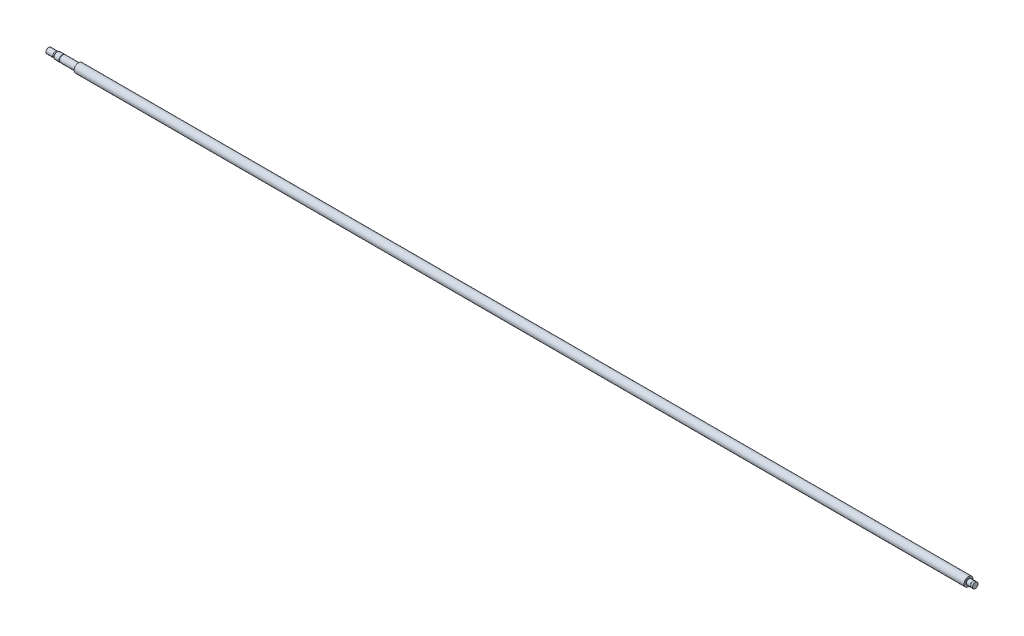
ISO-10303-21;
HEADER;
FILE_DESCRIPTION(('STEP AP214'),'2;1');
FILE_NAME('part.step','',(''),(''),'','','');
FILE_SCHEMA(('AUTOMOTIVE_DESIGN { 1 0 10303 214 1 1 1 1 }'));
ENDSEC;
DATA;
#1=APPLICATION_CONTEXT('core data for automotive mechanical design processes');
#2=APPLICATION_PROTOCOL_DEFINITION('international standard','automotive_design',2000,#1);
#3=PRODUCT_CONTEXT('',#1,'mechanical');
#4=PRODUCT('Part','Part','',(#3));
#5=PRODUCT_RELATED_PRODUCT_CATEGORY('part','',(#4));
#6=PRODUCT_DEFINITION_FORMATION('','',#4);
#7=PRODUCT_DEFINITION_CONTEXT('part definition',#1,'design');
#8=PRODUCT_DEFINITION('design','',#6,#7);
#9=PRODUCT_DEFINITION_SHAPE('','',#8);
#10=(LENGTH_UNIT() NAMED_UNIT(*) SI_UNIT(.MILLI.,.METRE.));
#11=(NAMED_UNIT(*) PLANE_ANGLE_UNIT() SI_UNIT($,.RADIAN.));
#12=(NAMED_UNIT(*) SI_UNIT($,.STERADIAN.) SOLID_ANGLE_UNIT());
#13=UNCERTAINTY_MEASURE_WITH_UNIT(LENGTH_MEASURE(1.E-05),#10,'distance_accuracy_value','');
#14=(GEOMETRIC_REPRESENTATION_CONTEXT(3) GLOBAL_UNCERTAINTY_ASSIGNED_CONTEXT((#13)) GLOBAL_UNIT_ASSIGNED_CONTEXT((#10,
#11,#12)) REPRESENTATION_CONTEXT('',''));
#15=CARTESIAN_POINT('',(0.,0.,0.));
#16=DIRECTION('',(0.,0.,1.));
#17=DIRECTION('',(1.,0.,0.));
#18=AXIS2_PLACEMENT_3D('',#15,#16,#17);
#19=CARTESIAN_POINT('',(-804.,0.,0.));
#20=DIRECTION('',(1.,0.,0.));
#21=DIRECTION('',(0.,1.,0.));
#22=AXIS2_PLACEMENT_3D('',#19,#20,#21);
#23=PLANE('',#22);
#24=CARTESIAN_POINT('',(-804.,0.,0.));
#25=DIRECTION('',(-1.,0.,0.));
#26=DIRECTION('',(0.,0.,1.));
#27=AXIS2_PLACEMENT_3D('',#24,#25,#26);
#28=CIRCLE('',#27,4.5);
#29=CARTESIAN_POINT('',(-804.,0.,4.5));
#30=VERTEX_POINT('',#29);
#31=EDGE_CURVE('E163',#30,#30,#28,.T.);
#32=ORIENTED_EDGE('',*,*,#31,.T.);
#33=EDGE_LOOP('',(#32));
#34=FACE_BOUND('',#33,.T.);
#35=ADVANCED_FACE('F17',(#34),#23,.F.);
#36=CARTESIAN_POINT('',(862.,0.,0.));
#37=DIRECTION('',(1.,0.,0.));
#38=DIRECTION('',(0.,1.,0.));
#39=AXIS2_PLACEMENT_3D('',#36,#37,#38);
#40=PLANE('',#39);
#41=CARTESIAN_POINT('',(862.,0.,0.));
#42=DIRECTION('',(1.,0.,0.));
#43=DIRECTION('',(0.,0.,1.));
#44=AXIS2_PLACEMENT_3D('',#41,#42,#43);
#45=CIRCLE('',#44,5.);
#46=CARTESIAN_POINT('',(862.,0.,5.));
#47=VERTEX_POINT('',#46);
#48=EDGE_CURVE('E27',#47,#47,#45,.T.);
#49=ORIENTED_EDGE('',*,*,#48,.T.);
#50=EDGE_LOOP('',(#49));
#51=FACE_BOUND('',#50,.T.);
#52=ADVANCED_FACE('F334',(#51),#40,.T.);
#53=CARTESIAN_POINT('',(157.,0.,0.));
#54=DIRECTION('',(1.,0.,0.));
#55=DIRECTION('',(0.,0.,-1.));
#56=AXIS2_PLACEMENT_3D('',#53,#54,#55);
#57=CYLINDRICAL_SURFACE('',#56,5.);
#58=ORIENTED_EDGE('',*,*,#48,.F.);
#59=DIRECTION('',(-1.,0.,0.));
#60=VECTOR('',#59,1.);
#61=CARTESIAN_POINT('',(157.,0.,5.));
#62=LINE('',#61,#60);
#63=CARTESIAN_POINT('',(859.15,0.,5.));
#64=VERTEX_POINT('',#63);
#65=EDGE_CURVE('E11',#47,#64,#62,.T.);
#66=ORIENTED_EDGE('',*,*,#65,.T.);
#67=CARTESIAN_POINT('',(859.15,0.,0.));
#68=DIRECTION('',(-1.,0.,0.));
#69=DIRECTION('',(0.,0.,-1.));
#70=AXIS2_PLACEMENT_3D('',#67,#68,#69);
#71=CIRCLE('',#70,5.);
#72=EDGE_CURVE('E200',#64,#64,#71,.T.);
#73=ORIENTED_EDGE('',*,*,#72,.F.);
#74=ORIENTED_EDGE('',*,*,#65,.F.);
#75=EDGE_LOOP('',(#58,#66,#73,#74));
#76=FACE_BOUND('',#75,.T.);
#77=ADVANCED_FACE('F340',(#76),#57,.T.);
#78=CARTESIAN_POINT('',(859.15,-5.,0.));
#79=DIRECTION('',(-1.,0.,0.));
#80=DIRECTION('',(0.,0.,1.));
#81=AXIS2_PLACEMENT_3D('',#78,#79,#80);
#82=PLANE('',#81);
#83=CARTESIAN_POINT('',(859.15,0.,0.));
#84=DIRECTION('',(1.,0.,0.));
#85=DIRECTION('',(0.,0.,1.));
#86=AXIS2_PLACEMENT_3D('',#83,#84,#85);
#87=CIRCLE('',#86,4.8);
#88=CARTESIAN_POINT('',(859.15,0.,4.8));
#89=VERTEX_POINT('',#88);
#90=EDGE_CURVE('E174',#89,#89,#87,.T.);
#91=ORIENTED_EDGE('',*,*,#90,.T.);
#92=EDGE_LOOP('',(#91));
#93=FACE_BOUND('',#92,.T.);
#94=ORIENTED_EDGE('',*,*,#72,.T.);
#95=EDGE_LOOP('',(#94));
#96=FACE_BOUND('',#95,.T.);
#97=ADVANCED_FACE('F329',(#93,#96),#82,.T.);
#98=CARTESIAN_POINT('',(157.,0.,0.));
#99=DIRECTION('',(1.,0.,0.));
#100=DIRECTION('',(0.,0.,-1.));
#101=AXIS2_PLACEMENT_3D('',#98,#99,#100);
#102=CYLINDRICAL_SURFACE('',#101,4.8);
#103=ORIENTED_EDGE('',*,*,#90,.F.);
#104=DIRECTION('',(-1.,0.,0.));
#105=VECTOR('',#104,1.);
#106=CARTESIAN_POINT('',(157.,0.,4.8));
#107=LINE('',#106,#105);
#108=CARTESIAN_POINT('',(858.,0.,4.8));
#109=VERTEX_POINT('',#108);
#110=EDGE_CURVE('E178',#89,#109,#107,.T.);
#111=ORIENTED_EDGE('',*,*,#110,.T.);
#112=CARTESIAN_POINT('',(858.,0.,0.));
#113=DIRECTION('',(-1.,0.,0.));
#114=DIRECTION('',(0.,0.,-1.));
#115=AXIS2_PLACEMENT_3D('',#112,#113,#114);
#116=CIRCLE('',#115,4.8);
#117=EDGE_CURVE('E179',#109,#109,#116,.T.);
#118=ORIENTED_EDGE('',*,*,#117,.F.);
#119=ORIENTED_EDGE('',*,*,#110,.F.);
#120=EDGE_LOOP('',(#103,#111,#118,#119));
#121=FACE_BOUND('',#120,.T.);
#122=ADVANCED_FACE('F320',(#121),#102,.T.);
#123=CARTESIAN_POINT('',(858.,-4.8,0.));
#124=DIRECTION('',(1.,0.,0.));
#125=DIRECTION('',(0.,1.,0.));
#126=AXIS2_PLACEMENT_3D('',#123,#124,#125);
#127=PLANE('',#126);
#128=ORIENTED_EDGE('',*,*,#117,.T.);
#129=EDGE_LOOP('',(#128));
#130=FACE_BOUND('',#129,.T.);
#131=CARTESIAN_POINT('',(858.,0.,0.));
#132=DIRECTION('',(1.,0.,0.));
#133=DIRECTION('',(0.,0.,-1.));
#134=AXIS2_PLACEMENT_3D('',#131,#132,#133);
#135=CIRCLE('',#134,5.);
#136=CARTESIAN_POINT('',(858.,0.,5.));
#137=VERTEX_POINT('',#136);
#138=EDGE_CURVE('E204',#137,#137,#135,.T.);
#139=ORIENTED_EDGE('',*,*,#138,.T.);
#140=EDGE_LOOP('',(#139));
#141=FACE_BOUND('',#140,.T.);
#142=ADVANCED_FACE('F318',(#130,#141),#127,.T.);
#143=CARTESIAN_POINT('',(157.,0.,0.));
#144=DIRECTION('',(1.,0.,0.));
#145=DIRECTION('',(0.,0.,-1.));
#146=AXIS2_PLACEMENT_3D('',#143,#144,#145);
#147=CYLINDRICAL_SURFACE('',#146,5.);
#148=ORIENTED_EDGE('',*,*,#138,.F.);
#149=DIRECTION('',(-1.,0.,0.));
#150=VECTOR('',#149,1.);
#151=CARTESIAN_POINT('',(157.,0.,5.));
#152=LINE('',#151,#150);
#153=CARTESIAN_POINT('',(850.972740661,0.,5.));
#154=VERTEX_POINT('',#153);
#155=EDGE_CURVE('E183',#137,#154,#152,.T.);
#156=ORIENTED_EDGE('',*,*,#155,.T.);
#157=CARTESIAN_POINT('',(850.972740661,0.,0.));
#158=DIRECTION('',(-1.,0.,0.));
#159=DIRECTION('',(0.,0.,1.));
#160=AXIS2_PLACEMENT_3D('',#157,#158,#159);
#161=CIRCLE('',#160,5.);
#162=EDGE_CURVE('E196',#154,#154,#161,.T.);
#163=ORIENTED_EDGE('',*,*,#162,.F.);
#164=ORIENTED_EDGE('',*,*,#155,.F.);
#165=EDGE_LOOP('',(#148,#156,#163,#164));
#166=FACE_BOUND('',#165,.T.);
#167=ADVANCED_FACE('F316',(#166),#147,.T.);
#168=CARTESIAN_POINT('',(850.612252235,0.,0.));
#169=DIRECTION('',(1.,0.,0.));
#170=DIRECTION('',(0.,0.,-1.));
#171=AXIS2_PLACEMENT_3D('',#168,#169,#170);
#172=CONICAL_SURFACE('',#171,4.903407417371,0.261799387799149);
#173=ORIENTED_EDGE('',*,*,#162,.T.);
#174=DIRECTION('',(-0.965925826289068,0.,-0.258819045102521));
#175=VECTOR('',#174,1.);
#176=CARTESIAN_POINT('',(850.612252235,0.,4.903407417371));
#177=LINE('',#176,#175);
#178=CARTESIAN_POINT('',(850.251763809,0.,4.806814834742));
#179=VERTEX_POINT('',#178);
#180=EDGE_CURVE('E201',#154,#179,#177,.T.);
#181=ORIENTED_EDGE('',*,*,#180,.T.);
#182=CARTESIAN_POINT('',(850.251763809,0.,0.));
#183=DIRECTION('',(-1.,0.,0.));
#184=DIRECTION('',(0.,0.,1.));
#185=AXIS2_PLACEMENT_3D('',#182,#183,#184);
#186=CIRCLE('',#185,4.806814834742);
#187=EDGE_CURVE('E197',#179,#179,#186,.T.);
#188=ORIENTED_EDGE('',*,*,#187,.F.);
#189=ORIENTED_EDGE('',*,*,#180,.F.);
#190=EDGE_LOOP('',(#173,#181,#188,#189));
#191=FACE_BOUND('',#190,.T.);
#192=ADVANCED_FACE('F311',(#191),#172,.T.);
#193=CARTESIAN_POINT('',(850.2,0.,0.));
#194=DIRECTION('',(1.,0.,0.));
#195=DIRECTION('',(0.,0.,-1.));
#196=AXIS2_PLACEMENT_3D('',#193,#194,#195);
#197=TOROIDAL_SURFACE('',#196,5.,0.2);
#198=ORIENTED_EDGE('',*,*,#187,.T.);
#199=CARTESIAN_POINT('',(850.2,0.,5.));
#200=DIRECTION('',(0.,1.,0.));
#201=DIRECTION('',(0.,0.,1.));
#202=AXIS2_PLACEMENT_3D('',#199,#200,#201);
#203=CIRCLE('',#202,0.2);
#204=CARTESIAN_POINT('',(850.,0.,5.));
#205=VERTEX_POINT('',#204);
#206=EDGE_CURVE('E193',#179,#205,#203,.T.);
#207=ORIENTED_EDGE('',*,*,#206,.T.);
#208=CARTESIAN_POINT('',(850.,0.,0.));
#209=DIRECTION('',(-1.,0.,0.));
#210=DIRECTION('',(0.,0.,-1.));
#211=AXIS2_PLACEMENT_3D('',#208,#209,#210);
#212=CIRCLE('',#211,5.);
#213=EDGE_CURVE('E171',#205,#205,#212,.T.);
#214=ORIENTED_EDGE('',*,*,#213,.F.);
#215=ORIENTED_EDGE('',*,*,#206,.F.);
#216=EDGE_LOOP('',(#198,#207,#214,#215));
#217=FACE_BOUND('',#216,.T.);
#218=ADVANCED_FACE('F377',(#217),#197,.F.);
#219=CARTESIAN_POINT('',(850.,0.,0.));
#220=DIRECTION('',(-1.,0.,0.));
#221=DIRECTION('',(0.,0.,1.));
#222=AXIS2_PLACEMENT_3D('',#219,#220,#221);
#223=PLANE('',#222);
#224=ORIENTED_EDGE('',*,*,#213,.T.);
#225=EDGE_LOOP('',(#224));
#226=FACE_BOUND('',#225,.T.);
#227=CARTESIAN_POINT('',(850.,0.,0.));
#228=DIRECTION('',(1.,0.,0.));
#229=DIRECTION('',(0.,0.,-1.));
#230=AXIS2_PLACEMENT_3D('',#227,#228,#229);
#231=CIRCLE('',#230,8.);
#232=CARTESIAN_POINT('',(850.,0.,-8.));
#233=VERTEX_POINT('',#232);
#234=EDGE_CURVE('E169',#233,#233,#231,.T.);
#235=ORIENTED_EDGE('',*,*,#234,.T.);
#236=EDGE_LOOP('',(#235));
#237=FACE_BOUND('',#236,.T.);
#238=ADVANCED_FACE('F375',(#226,#237),#223,.F.);
#239=CARTESIAN_POINT('',(750.,0.,0.));
#240=DIRECTION('',(-1.,0.,0.));
#241=DIRECTION('',(0.,0.,1.));
#242=AXIS2_PLACEMENT_3D('',#239,#240,#241);
#243=CYLINDRICAL_SURFACE('',#242,8.);
#244=CARTESIAN_POINT('',(-750.,0.,0.));
#245=DIRECTION('',(-1.,0.,0.));
#246=DIRECTION('',(0.,0.,1.));
#247=AXIS2_PLACEMENT_3D('',#244,#245,#246);
#248=CIRCLE('',#247,8.);
#249=CARTESIAN_POINT('',(-750.,0.,-8.));
#250=VERTEX_POINT('',#249);
#251=EDGE_CURVE('E258',#250,#250,#248,.T.);
#252=ORIENTED_EDGE('',*,*,#251,.F.);
#253=DIRECTION('',(1.,0.,0.));
#254=VECTOR('',#253,1.);
#255=CARTESIAN_POINT('',(750.,0.,-8.));
#256=LINE('',#255,#254);
#257=EDGE_CURVE('E172',#250,#233,#256,.T.);
#258=ORIENTED_EDGE('',*,*,#257,.T.);
#259=ORIENTED_EDGE('',*,*,#234,.F.);
#260=ORIENTED_EDGE('',*,*,#257,.F.);
#261=EDGE_LOOP('',(#252,#258,#259,#260));
#262=FACE_BOUND('',#261,.T.);
#263=ADVANCED_FACE('F369',(#262),#243,.T.);
#264=CARTESIAN_POINT('',(-750.,0.,0.));
#265=DIRECTION('',(-1.,0.,0.));
#266=DIRECTION('',(0.,0.,1.));
#267=AXIS2_PLACEMENT_3D('',#264,#265,#266);
#268=PLANE('',#267);
#269=CARTESIAN_POINT('',(-750.,0.,0.));
#270=DIRECTION('',(1.,0.,0.));
#271=DIRECTION('',(0.,0.,-1.));
#272=AXIS2_PLACEMENT_3D('',#269,#270,#271);
#273=CIRCLE('',#272,6.);
#274=CARTESIAN_POINT('',(-750.,0.,6.));
#275=VERTEX_POINT('',#274);
#276=EDGE_CURVE('E259',#275,#275,#273,.T.);
#277=ORIENTED_EDGE('',*,*,#276,.T.);
#278=EDGE_LOOP('',(#277));
#279=FACE_BOUND('',#278,.T.);
#280=ORIENTED_EDGE('',*,*,#251,.T.);
#281=EDGE_LOOP('',(#280));
#282=FACE_BOUND('',#281,.T.);
#283=ADVANCED_FACE('F366',(#279,#282),#268,.T.);
#284=CARTESIAN_POINT('',(-750.2,0.,0.));
#285=DIRECTION('',(1.,0.,0.));
#286=DIRECTION('',(0.,0.,-1.));
#287=AXIS2_PLACEMENT_3D('',#284,#285,#286);
#288=TOROIDAL_SURFACE('',#287,6.,0.2);
#289=ORIENTED_EDGE('',*,*,#276,.F.);
#290=CARTESIAN_POINT('',(-750.2,0.,6.));
#291=DIRECTION('',(0.,1.,0.));
#292=DIRECTION('',(0.,0.,1.));
#293=AXIS2_PLACEMENT_3D('',#290,#291,#292);
#294=CIRCLE('',#293,0.2);
#295=CARTESIAN_POINT('',(-750.251763809,0.,5.806814834742));
#296=VERTEX_POINT('',#295);
#297=EDGE_CURVE('E255',#275,#296,#294,.T.);
#298=ORIENTED_EDGE('',*,*,#297,.T.);
#299=CARTESIAN_POINT('',(-750.251763809,0.,0.));
#300=DIRECTION('',(1.,0.,0.));
#301=DIRECTION('',(0.,0.,-1.));
#302=AXIS2_PLACEMENT_3D('',#299,#300,#301);
#303=CIRCLE('',#302,5.806814834742);
#304=CARTESIAN_POINT('',(-750.251763809,0.,-5.806814834742));
#305=VERTEX_POINT('',#304);
#306=EDGE_CURVE('E222',#296,#305,#303,.T.);
#307=ORIENTED_EDGE('',*,*,#306,.T.);
#308=CARTESIAN_POINT('',(-750.251763809,0.,0.));
#309=DIRECTION('',(1.,0.,0.));
#310=DIRECTION('',(0.,0.,-1.));
#311=AXIS2_PLACEMENT_3D('',#308,#309,#310);
#312=CIRCLE('',#311,5.806814834742);
#313=EDGE_CURVE('E226',#305,#296,#312,.T.);
#314=ORIENTED_EDGE('',*,*,#313,.T.);
#315=ORIENTED_EDGE('',*,*,#297,.F.);
#316=EDGE_LOOP('',(#289,#298,#307,#314,#315));
#317=FACE_BOUND('',#316,.T.);
#318=ADVANCED_FACE('F364',(#317),#288,.F.);
#319=CARTESIAN_POINT('',(-750.612252235,0.,0.));
#320=DIRECTION('',(-1.,0.,0.));
#321=DIRECTION('',(0.,0.,1.));
#322=AXIS2_PLACEMENT_3D('',#319,#320,#321);
#323=CONICAL_SURFACE('',#322,5.903407417371,0.261799387799149);
#324=CARTESIAN_POINT('',(-750.972740661,0.,0.));
#325=DIRECTION('',(1.,0.,0.));
#326=DIRECTION('',(0.,0.,1.));
#327=AXIS2_PLACEMENT_3D('',#324,#325,#326);
#328=CIRCLE('',#327,6.);
#329=CARTESIAN_POINT('',(-750.972740661,0.,6.));
#330=VERTEX_POINT('',#329);
#331=CARTESIAN_POINT('',(-750.972740661,0.,-5.99999999999856));
#332=VERTEX_POINT('',#331);
#333=EDGE_CURVE('E218',#330,#332,#328,.T.);
#334=ORIENTED_EDGE('',*,*,#333,.T.);
#335=DIRECTION('',(0.965925826289068,0.,0.258819045102521));
#336=VECTOR('',#335,1.);
#337=CARTESIAN_POINT('',(-750.612252235,0.,-5.903407417371));
#338=LINE('',#337,#336);
#339=EDGE_CURVE('E227',#332,#305,#338,.T.);
#340=ORIENTED_EDGE('',*,*,#339,.T.);
#341=ORIENTED_EDGE('',*,*,#306,.F.);
#342=ORIENTED_EDGE('',*,*,#313,.F.);
#343=ORIENTED_EDGE('',*,*,#339,.F.);
#344=CARTESIAN_POINT('',(-750.972740661,0.,0.));
#345=DIRECTION('',(1.,0.,0.));
#346=DIRECTION('',(0.,0.,1.));
#347=AXIS2_PLACEMENT_3D('',#344,#345,#346);
#348=CIRCLE('',#347,6.);
#349=EDGE_CURVE('E217',#332,#330,#348,.T.);
#350=ORIENTED_EDGE('',*,*,#349,.T.);
#351=EDGE_LOOP('',(#334,#340,#341,#342,#343,#350));
#352=FACE_BOUND('',#351,.T.);
#353=ADVANCED_FACE('F354',(#352),#323,.T.);
#354=CARTESIAN_POINT('',(57.,0.,0.));
#355=DIRECTION('',(1.,0.,0.));
#356=DIRECTION('',(0.,0.,-1.));
#357=AXIS2_PLACEMENT_3D('',#354,#355,#356);
#358=CYLINDRICAL_SURFACE('',#357,6.);
#359=ORIENTED_EDGE('',*,*,#333,.F.);
#360=DIRECTION('',(-1.,0.,0.));
#361=VECTOR('',#360,1.);
#362=CARTESIAN_POINT('',(57.,0.,6.));
#363=LINE('',#362,#361);
#364=CARTESIAN_POINT('',(-778.,0.,5.99999999999178));
#365=VERTEX_POINT('',#364);
#366=EDGE_CURVE('E214',#330,#365,#363,.T.);
#367=ORIENTED_EDGE('',*,*,#366,.T.);
#368=CARTESIAN_POINT('',(-778.,0.,0.));
#369=DIRECTION('',(-1.,0.,0.));
#370=DIRECTION('',(0.,0.,-1.));
#371=AXIS2_PLACEMENT_3D('',#368,#369,#370);
#372=CIRCLE('',#371,6.);
#373=EDGE_CURVE('E188',#365,#365,#372,.T.);
#374=ORIENTED_EDGE('',*,*,#373,.F.);
#375=ORIENTED_EDGE('',*,*,#366,.F.);
#376=ORIENTED_EDGE('',*,*,#349,.F.);
#377=EDGE_LOOP('',(#359,#367,#374,#375,#376));
#378=FACE_BOUND('',#377,.T.);
#379=ADVANCED_FACE('F347',(#378),#358,.T.);
#380=CARTESIAN_POINT('',(-778.1236860279,0.,0.));
#381=DIRECTION('',(1.,0.,0.));
#382=DIRECTION('',(0.,0.,-1.));
#383=AXIS2_PLACEMENT_3D('',#380,#381,#382);
#384=CONICAL_SURFACE('',#383,5.928589838486,0.523598775598473);
#385=ORIENTED_EDGE('',*,*,#373,.T.);
#386=DIRECTION('',(-0.866025403784351,0.,-0.500000000000151));
#387=VECTOR('',#386,1.);
#388=CARTESIAN_POINT('',(-778.1236860279,0.,5.928589838486));
#389=LINE('',#388,#387);
#390=CARTESIAN_POINT('',(-778.2473720558,0.,5.857179676973));
#391=VERTEX_POINT('',#390);
#392=EDGE_CURVE('E192',#365,#391,#389,.T.);
#393=ORIENTED_EDGE('',*,*,#392,.T.);
#394=CARTESIAN_POINT('',(-778.2473720558,0.,0.));
#395=DIRECTION('',(-1.,0.,0.));
#396=DIRECTION('',(0.,0.,-1.));
#397=AXIS2_PLACEMENT_3D('',#394,#395,#396);
#398=CIRCLE('',#397,5.857179676973);
#399=EDGE_CURVE('E146',#391,#391,#398,.T.);
#400=ORIENTED_EDGE('',*,*,#399,.F.);
#401=ORIENTED_EDGE('',*,*,#392,.F.);
#402=EDGE_LOOP('',(#385,#393,#400,#401));
#403=FACE_BOUND('',#402,.T.);
#404=ADVANCED_FACE('F344',(#403),#384,.T.);
#405=CARTESIAN_POINT('',(-778.6473720558,0.,0.));
#406=DIRECTION('',(1.,0.,0.));
#407=DIRECTION('',(0.,0.,-1.));
#408=AXIS2_PLACEMENT_3D('',#405,#406,#407);
#409=TOROIDAL_SURFACE('',#408,6.55,0.8);
#410=ORIENTED_EDGE('',*,*,#399,.T.);
#411=CARTESIAN_POINT('',(-778.6473720558,0.,6.55));
#412=DIRECTION('',(0.,1.,0.));
#413=DIRECTION('',(0.,0.,1.));
#414=AXIS2_PLACEMENT_3D('',#411,#412,#413);
#415=CIRCLE('',#414,0.8);
#416=CARTESIAN_POINT('',(-779.2283195578,0.,6.));
#417=VERTEX_POINT('',#416);
#418=EDGE_CURVE('E187',#391,#417,#415,.T.);
#419=ORIENTED_EDGE('',*,*,#418,.T.);
#420=CARTESIAN_POINT('',(-779.2283195578,0.,0.));
#421=DIRECTION('',(1.,0.,0.));
#422=DIRECTION('',(0.,0.,1.));
#423=AXIS2_PLACEMENT_3D('',#420,#421,#422);
#424=CIRCLE('',#423,6.);
#425=EDGE_CURVE('E144',#417,#417,#424,.T.);
#426=ORIENTED_EDGE('',*,*,#425,.T.);
#427=ORIENTED_EDGE('',*,*,#418,.F.);
#428=EDGE_LOOP('',(#410,#419,#426,#427));
#429=FACE_BOUND('',#428,.T.);
#430=ADVANCED_FACE('F346',(#429),#409,.F.);
#431=CARTESIAN_POINT('',(57.,0.,0.));
#432=DIRECTION('',(1.,0.,0.));
#433=DIRECTION('',(0.,0.,-1.));
#434=AXIS2_PLACEMENT_3D('',#431,#432,#433);
#435=CYLINDRICAL_SURFACE('',#434,6.);
#436=ORIENTED_EDGE('',*,*,#425,.F.);
#437=DIRECTION('',(-1.,0.,0.));
#438=VECTOR('',#437,1.);
#439=CARTESIAN_POINT('',(57.,0.,6.));
#440=LINE('',#439,#438);
#441=CARTESIAN_POINT('',(-788.,0.,6.));
#442=VERTEX_POINT('',#441);
#443=EDGE_CURVE('E138',#417,#442,#440,.T.);
#444=ORIENTED_EDGE('',*,*,#443,.T.);
#445=CARTESIAN_POINT('',(-788.,0.,0.));
#446=DIRECTION('',(-1.,0.,0.));
#447=DIRECTION('',(0.,0.,-1.));
#448=AXIS2_PLACEMENT_3D('',#445,#446,#447);
#449=CIRCLE('',#448,6.);
#450=EDGE_CURVE('E142',#442,#442,#449,.T.);
#451=ORIENTED_EDGE('',*,*,#450,.F.);
#452=ORIENTED_EDGE('',*,*,#443,.F.);
#453=EDGE_LOOP('',(#436,#444,#451,#452));
#454=FACE_BOUND('',#453,.T.);
#455=ADVANCED_FACE('F140',(#454),#435,.T.);
#456=CARTESIAN_POINT('',(-788.5,0.,0.));
#457=DIRECTION('',(1.,0.,0.));
#458=DIRECTION('',(0.,0.,-1.));
#459=AXIS2_PLACEMENT_3D('',#456,#457,#458);
#460=CONICAL_SURFACE('',#459,5.5,0.785398163397448);
#461=ORIENTED_EDGE('',*,*,#450,.T.);
#462=DIRECTION('',(-0.707106781186548,0.,-0.707106781186548));
#463=VECTOR('',#462,1.);
#464=CARTESIAN_POINT('',(-788.5,0.,5.5));
#465=LINE('',#464,#463);
#466=CARTESIAN_POINT('',(-789.,0.,5.));
#467=VERTEX_POINT('',#466);
#468=EDGE_CURVE('E150',#442,#467,#465,.T.);
#469=ORIENTED_EDGE('',*,*,#468,.T.);
#470=CARTESIAN_POINT('',(-789.,0.,0.));
#471=DIRECTION('',(-1.,0.,0.));
#472=DIRECTION('',(0.,0.,-1.));
#473=AXIS2_PLACEMENT_3D('',#470,#471,#472);
#474=CIRCLE('',#473,5.);
#475=EDGE_CURVE('E153',#467,#467,#474,.T.);
#476=ORIENTED_EDGE('',*,*,#475,.F.);
#477=ORIENTED_EDGE('',*,*,#468,.F.);
#478=EDGE_LOOP('',(#461,#469,#476,#477));
#479=FACE_BOUND('',#478,.T.);
#480=ADVANCED_FACE('F151',(#479),#460,.T.);
#481=CARTESIAN_POINT('',(-803.75,0.,0.));
#482=DIRECTION('',(1.,0.,0.));
#483=DIRECTION('',(0.,0.,-1.));
#484=AXIS2_PLACEMENT_3D('',#481,#482,#483);
#485=CONICAL_SURFACE('',#484,4.75,0.785398163397448);
#486=CARTESIAN_POINT('',(-803.5,0.,0.));
#487=DIRECTION('',(-1.,0.,0.));
#488=DIRECTION('',(0.,0.,1.));
#489=AXIS2_PLACEMENT_3D('',#486,#487,#488);
#490=CIRCLE('',#489,5.);
#491=CARTESIAN_POINT('',(-803.5,0.,5.));
#492=VERTEX_POINT('',#491);
#493=EDGE_CURVE('E209',#492,#492,#490,.T.);
#494=ORIENTED_EDGE('',*,*,#493,.T.);
#495=DIRECTION('',(-0.707106781186548,0.,-0.707106781186548));
#496=VECTOR('',#495,1.);
#497=CARTESIAN_POINT('',(-803.75,0.,4.75));
#498=LINE('',#497,#496);
#499=EDGE_CURVE('E205',#492,#30,#498,.T.);
#500=ORIENTED_EDGE('',*,*,#499,.T.);
#501=ORIENTED_EDGE('',*,*,#31,.F.);
#502=ORIENTED_EDGE('',*,*,#499,.F.);
#503=EDGE_LOOP('',(#494,#500,#501,#502));
#504=FACE_BOUND('',#503,.T.);
#505=ADVANCED_FACE('F391',(#504),#485,.T.);
#506=CARTESIAN_POINT('',(57.,0.,0.));
#507=DIRECTION('',(1.,0.,0.));
#508=DIRECTION('',(0.,0.,-1.));
#509=AXIS2_PLACEMENT_3D('',#506,#507,#508);
#510=CYLINDRICAL_SURFACE('',#509,5.);
#511=CARTESIAN_POINT('',(-791.4318516526,0.,0.));
#512=DIRECTION('',(1.,0.,0.));
#513=DIRECTION('',(0.,0.,-1.));
#514=AXIS2_PLACEMENT_3D('',#511,#512,#513);
#515=CIRCLE('',#514,5.);
#516=CARTESIAN_POINT('',(-791.4318516526,0.,-5.));
#517=VERTEX_POINT('',#516);
#518=CARTESIAN_POINT('',(-791.4318516526,0.,5.));
#519=VERTEX_POINT('',#518);
#520=EDGE_CURVE('E247',#517,#519,#515,.T.);
#521=ORIENTED_EDGE('',*,*,#520,.F.);
#522=CARTESIAN_POINT('',(-791.4318516526,0.,0.));
#523=DIRECTION('',(1.,0.,0.));
#524=DIRECTION('',(0.,0.,-1.));
#525=AXIS2_PLACEMENT_3D('',#522,#523,#524);
#526=CIRCLE('',#525,5.);
#527=EDGE_CURVE('E251',#519,#517,#526,.T.);
#528=ORIENTED_EDGE('',*,*,#527,.F.);
#529=DIRECTION('',(-1.,0.,0.));
#530=VECTOR('',#529,1.);
#531=CARTESIAN_POINT('',(57.,0.,5.));
#532=LINE('',#531,#530);
#533=EDGE_CURVE('E210',#519,#492,#532,.T.);
#534=ORIENTED_EDGE('',*,*,#533,.T.);
#535=ORIENTED_EDGE('',*,*,#493,.F.);
#536=ORIENTED_EDGE('',*,*,#533,.F.);
#537=EDGE_LOOP('',(#521,#528,#534,#535,#536));
#538=FACE_BOUND('',#537,.T.);
#539=ADVANCED_FACE('F394',(#538),#510,.T.);
#540=CARTESIAN_POINT('',(-790.5306305876,0.,0.));
#541=DIRECTION('',(-1.,0.,0.));
#542=DIRECTION('',(0.,0.,1.));
#543=AXIS2_PLACEMENT_3D('',#540,#541,#542);
#544=CONICAL_SURFACE('',#543,4.758518543428,0.261799387799149);
#545=ORIENTED_EDGE('',*,*,#520,.T.);
#546=ORIENTED_EDGE('',*,*,#527,.T.);
#547=DIRECTION('',(0.965925826289068,0.,0.258819045102521));
#548=VECTOR('',#547,1.);
#549=CARTESIAN_POINT('',(-790.5306305876,0.,-4.758518543428));
#550=LINE('',#549,#548);
#551=CARTESIAN_POINT('',(-789.6294095226,0.,-4.517037086855));
#552=VERTEX_POINT('',#551);
#553=EDGE_CURVE('E167',#517,#552,#550,.T.);
#554=ORIENTED_EDGE('',*,*,#553,.T.);
#555=CARTESIAN_POINT('',(-789.6294095226,0.,0.));
#556=DIRECTION('',(1.,0.,0.));
#557=DIRECTION('',(0.,0.,-1.));
#558=AXIS2_PLACEMENT_3D('',#555,#556,#557);
#559=CIRCLE('',#558,4.517037086855);
#560=CARTESIAN_POINT('',(-789.6294095226,0.,4.517037086855));
#561=VERTEX_POINT('',#560);
#562=EDGE_CURVE('E264',#561,#552,#559,.T.);
#563=ORIENTED_EDGE('',*,*,#562,.F.);
#564=CARTESIAN_POINT('',(-789.6294095226,0.,0.));
#565=DIRECTION('',(1.,0.,0.));
#566=DIRECTION('',(0.,0.,-1.));
#567=AXIS2_PLACEMENT_3D('',#564,#565,#566);
#568=CIRCLE('',#567,4.517037086855);
#569=EDGE_CURVE('E252',#552,#561,#568,.T.);
#570=ORIENTED_EDGE('',*,*,#569,.F.);
#571=ORIENTED_EDGE('',*,*,#553,.F.);
#572=EDGE_LOOP('',(#545,#546,#554,#563,#570,#571));
#573=FACE_BOUND('',#572,.T.);
#574=ADVANCED_FACE('F19',(#573),#544,.T.);
#575=CARTESIAN_POINT('',(-789.5,0.,0.));
#576=DIRECTION('',(1.,0.,0.));
#577=DIRECTION('',(0.,0.,-1.));
#578=AXIS2_PLACEMENT_3D('',#575,#576,#577);
#579=TOROIDAL_SURFACE('',#578,5.,0.5);
#580=ORIENTED_EDGE('',*,*,#475,.T.);
#581=CARTESIAN_POINT('',(-789.5,0.,5.));
#582=DIRECTION('',(0.,1.,0.));
#583=DIRECTION('',(0.,0.,1.));
#584=AXIS2_PLACEMENT_3D('',#581,#582,#583);
#585=CIRCLE('',#584,0.5);
#586=EDGE_CURVE('E260',#467,#561,#585,.T.);
#587=ORIENTED_EDGE('',*,*,#586,.T.);
#588=ORIENTED_EDGE('',*,*,#562,.T.);
#589=ORIENTED_EDGE('',*,*,#569,.T.);
#590=ORIENTED_EDGE('',*,*,#586,.F.);
#591=EDGE_LOOP('',(#580,#587,#588,#589,#590));
#592=FACE_BOUND('',#591,.T.);
#593=ADVANCED_FACE('F396',(#592),#579,.F.);
#594=CLOSED_SHELL('',(#35,#52,#77,#97,#122,#142,#167,#192,#218,#238,#263,#283,#318,#353,#379,
#404,#430,#455,#480,#505,#539,#574,#593));
#595=MANIFOLD_SOLID_BREP('B1',#594);
#596=ADVANCED_BREP_SHAPE_REPRESENTATION('',(#18,#595),#14);
#597=SHAPE_DEFINITION_REPRESENTATION(#9,#596);
ENDSEC;
END-ISO-10303-21;
